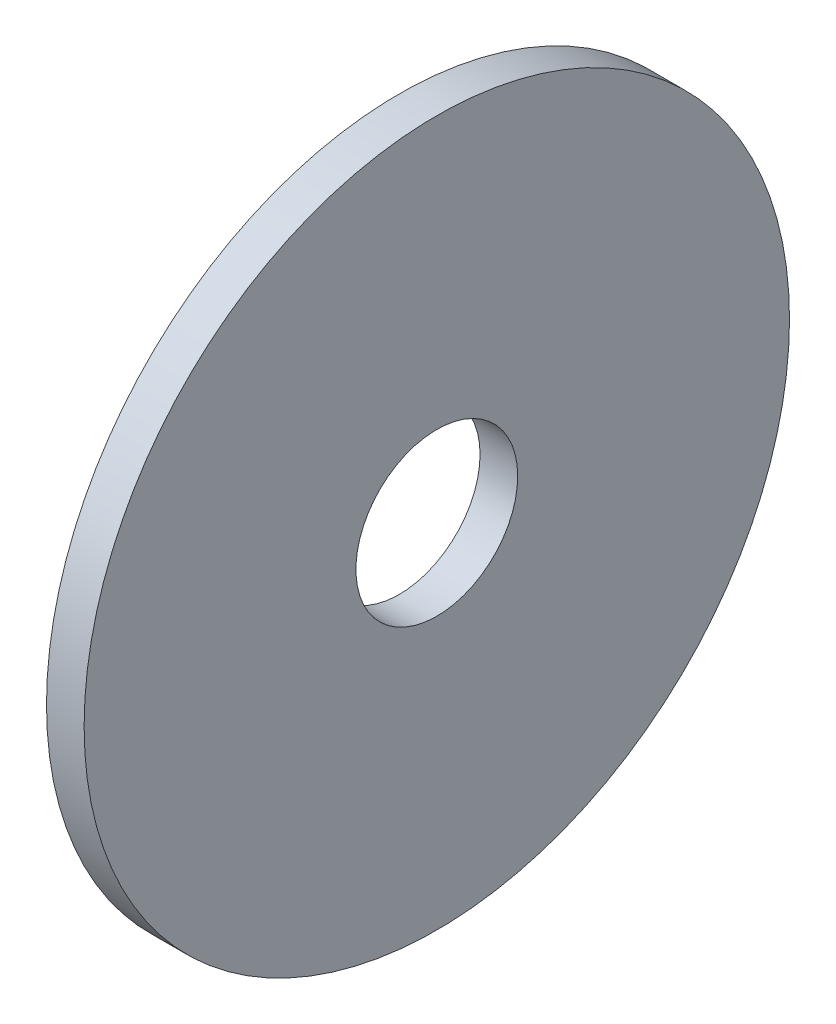
ISO-10303-21;
HEADER;
FILE_DESCRIPTION(('STEP AP214'),'2;1');
FILE_NAME('part.step','',(''),(''),'','','');
FILE_SCHEMA(('AUTOMOTIVE_DESIGN { 1 0 10303 214 1 1 1 1 }'));
ENDSEC;
DATA;
#1=APPLICATION_CONTEXT('core data for automotive mechanical design processes');
#2=APPLICATION_PROTOCOL_DEFINITION('international standard','automotive_design',2000,#1);
#3=PRODUCT_CONTEXT('',#1,'mechanical');
#4=PRODUCT('Part','Part','',(#3));
#5=PRODUCT_RELATED_PRODUCT_CATEGORY('part','',(#4));
#6=PRODUCT_DEFINITION_FORMATION('','',#4);
#7=PRODUCT_DEFINITION_CONTEXT('part definition',#1,'design');
#8=PRODUCT_DEFINITION('design','',#6,#7);
#9=PRODUCT_DEFINITION_SHAPE('','',#8);
#10=(LENGTH_UNIT() NAMED_UNIT(*) SI_UNIT(.MILLI.,.METRE.));
#11=(NAMED_UNIT(*) PLANE_ANGLE_UNIT() SI_UNIT($,.RADIAN.));
#12=(NAMED_UNIT(*) SI_UNIT($,.STERADIAN.) SOLID_ANGLE_UNIT());
#13=UNCERTAINTY_MEASURE_WITH_UNIT(LENGTH_MEASURE(1.E-05),#10,'distance_accuracy_value','');
#14=(GEOMETRIC_REPRESENTATION_CONTEXT(3) GLOBAL_UNCERTAINTY_ASSIGNED_CONTEXT((#13)) GLOBAL_UNIT_ASSIGNED_CONTEXT((#10,
#11,#12)) REPRESENTATION_CONTEXT('',''));
#15=CARTESIAN_POINT('',(0.,0.,0.));
#16=DIRECTION('',(0.,0.,1.));
#17=DIRECTION('',(1.,0.,0.));
#18=AXIS2_PLACEMENT_3D('',#15,#16,#17);
#19=CARTESIAN_POINT('',(2.032,0.,0.));
#20=DIRECTION('',(1.,0.,0.));
#21=DIRECTION('',(0.,0.,-1.));
#22=AXIS2_PLACEMENT_3D('',#19,#20,#21);
#23=PLANE('',#22);
#24=CARTESIAN_POINT('',(2.032,0.,0.));
#25=DIRECTION('',(1.,0.,0.));
#26=DIRECTION('',(0.,0.,-1.));
#27=AXIS2_PLACEMENT_3D('',#24,#25,#26);
#28=CIRCLE('',#27,19.05);
#29=CARTESIAN_POINT('',(2.032,0.,-19.05));
#30=VERTEX_POINT('',#29);
#31=EDGE_CURVE('E10',#30,#30,#28,.T.);
#32=ORIENTED_EDGE('',*,*,#31,.T.);
#33=EDGE_LOOP('',(#32));
#34=FACE_BOUND('',#33,.T.);
#35=CARTESIAN_POINT('',(2.032,0.,0.));
#36=DIRECTION('',(1.,0.,0.));
#37=DIRECTION('',(0.,0.,-1.));
#38=AXIS2_PLACEMENT_3D('',#35,#36,#37);
#39=CIRCLE('',#38,4.3688);
#40=CARTESIAN_POINT('',(2.032,0.,-4.3688));
#41=VERTEX_POINT('',#40);
#42=EDGE_CURVE('E41',#41,#41,#39,.T.);
#43=ORIENTED_EDGE('',*,*,#42,.F.);
#44=EDGE_LOOP('',(#43));
#45=FACE_BOUND('',#44,.T.);
#46=ADVANCED_FACE('F30',(#34,#45),#23,.T.);
#47=CARTESIAN_POINT('',(0.,0.,0.));
#48=DIRECTION('',(1.,0.,0.));
#49=DIRECTION('',(0.,0.,-1.));
#50=AXIS2_PLACEMENT_3D('',#47,#48,#49);
#51=PLANE('',#50);
#52=CARTESIAN_POINT('',(0.,0.,0.));
#53=DIRECTION('',(1.,0.,0.));
#54=DIRECTION('',(0.,0.,-1.));
#55=AXIS2_PLACEMENT_3D('',#52,#53,#54);
#56=CIRCLE('',#55,19.05);
#57=CARTESIAN_POINT('',(0.,0.,-19.05));
#58=VERTEX_POINT('',#57);
#59=EDGE_CURVE('E34',#58,#58,#56,.T.);
#60=ORIENTED_EDGE('',*,*,#59,.F.);
#61=EDGE_LOOP('',(#60));
#62=FACE_BOUND('',#61,.T.);
#63=CARTESIAN_POINT('',(0.,0.,0.));
#64=DIRECTION('',(1.,0.,0.));
#65=DIRECTION('',(0.,0.,-1.));
#66=AXIS2_PLACEMENT_3D('',#63,#64,#65);
#67=CIRCLE('',#66,4.3688);
#68=CARTESIAN_POINT('',(0.,0.,-4.3688));
#69=VERTEX_POINT('',#68);
#70=EDGE_CURVE('E43',#69,#69,#67,.T.);
#71=ORIENTED_EDGE('',*,*,#70,.T.);
#72=EDGE_LOOP('',(#71));
#73=FACE_BOUND('',#72,.T.);
#74=ADVANCED_FACE('F53',(#62,#73),#51,.F.);
#75=CARTESIAN_POINT('',(2.032,0.,0.));
#76=DIRECTION('',(-1.,0.,0.));
#77=DIRECTION('',(0.,0.,1.));
#78=AXIS2_PLACEMENT_3D('',#75,#76,#77);
#79=CYLINDRICAL_SURFACE('',#78,19.05);
#80=ORIENTED_EDGE('',*,*,#31,.F.);
#81=EDGE_LOOP('',(#80));
#82=FACE_BOUND('',#81,.T.);
#83=ORIENTED_EDGE('',*,*,#59,.T.);
#84=EDGE_LOOP('',(#83));
#85=FACE_BOUND('',#84,.T.);
#86=ADVANCED_FACE('F32',(#82,#85),#79,.T.);
#87=CARTESIAN_POINT('',(2.032,0.,0.));
#88=DIRECTION('',(-1.,0.,0.));
#89=DIRECTION('',(0.,0.,1.));
#90=AXIS2_PLACEMENT_3D('',#87,#88,#89);
#91=CYLINDRICAL_SURFACE('',#90,4.3688);
#92=ORIENTED_EDGE('',*,*,#42,.T.);
#93=EDGE_LOOP('',(#92));
#94=FACE_BOUND('',#93,.T.);
#95=ORIENTED_EDGE('',*,*,#70,.F.);
#96=EDGE_LOOP('',(#95));
#97=FACE_BOUND('',#96,.T.);
#98=ADVANCED_FACE('F49',(#94,#97),#91,.F.);
#99=CLOSED_SHELL('',(#46,#74,#86,#98));
#100=MANIFOLD_SOLID_BREP('B2',#99);
#101=ADVANCED_BREP_SHAPE_REPRESENTATION('',(#18,#100),#14);
#102=SHAPE_DEFINITION_REPRESENTATION(#9,#101);
ENDSEC;
END-ISO-10303-21;
